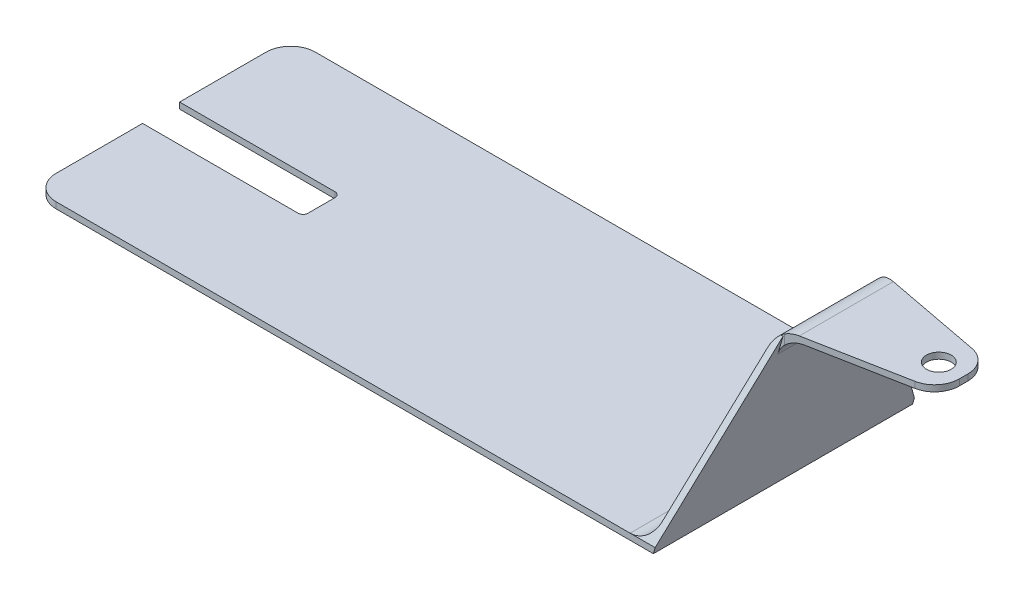
ISO-10303-21;
HEADER;
FILE_DESCRIPTION(('STEP AP214'),'2;1');
FILE_NAME('part.step','',(''),(''),'','','');
FILE_SCHEMA(('AUTOMOTIVE_DESIGN { 1 0 10303 214 1 1 1 1 }'));
ENDSEC;
DATA;
#1=APPLICATION_CONTEXT('core data for automotive mechanical design processes');
#2=APPLICATION_PROTOCOL_DEFINITION('international standard','automotive_design',2000,#1);
#3=PRODUCT_CONTEXT('',#1,'mechanical');
#4=PRODUCT('Part','Part','',(#3));
#5=PRODUCT_RELATED_PRODUCT_CATEGORY('part','',(#4));
#6=PRODUCT_DEFINITION_FORMATION('','',#4);
#7=PRODUCT_DEFINITION_CONTEXT('part definition',#1,'design');
#8=PRODUCT_DEFINITION('design','',#6,#7);
#9=PRODUCT_DEFINITION_SHAPE('','',#8);
#10=(LENGTH_UNIT() NAMED_UNIT(*) SI_UNIT(.MILLI.,.METRE.));
#11=(NAMED_UNIT(*) PLANE_ANGLE_UNIT() SI_UNIT($,.RADIAN.));
#12=(NAMED_UNIT(*) SI_UNIT($,.STERADIAN.) SOLID_ANGLE_UNIT());
#13=UNCERTAINTY_MEASURE_WITH_UNIT(LENGTH_MEASURE(1.E-05),#10,'distance_accuracy_value','');
#14=(GEOMETRIC_REPRESENTATION_CONTEXT(3) GLOBAL_UNCERTAINTY_ASSIGNED_CONTEXT((#13)) GLOBAL_UNIT_ASSIGNED_CONTEXT((#10,
#11,#12)) REPRESENTATION_CONTEXT('',''));
#15=CARTESIAN_POINT('',(0.,0.,0.));
#16=DIRECTION('',(0.,0.,1.));
#17=DIRECTION('',(1.,0.,0.));
#18=AXIS2_PLACEMENT_3D('',#15,#16,#17);
#19=CARTESIAN_POINT('',(200.,68.75,105.));
#20=DIRECTION('',(0.,-1.,0.));
#21=DIRECTION('',(1.,0.,0.));
#22=AXIS2_PLACEMENT_3D('',#19,#20,#21);
#23=PLANE('',#22);
#24=CARTESIAN_POINT('',(190.,68.75,52.5));
#25=DIRECTION('',(0.,-1.,0.));
#26=DIRECTION('',(1.,0.,0.));
#27=AXIS2_PLACEMENT_3D('',#24,#25,#26);
#28=CIRCLE('',#27,5.00000000000002);
#29=CARTESIAN_POINT('',(195.,68.75,52.5));
#30=VERTEX_POINT('',#29);
#31=EDGE_CURVE('E845',#30,#30,#28,.F.);
#32=ORIENTED_EDGE('',*,*,#31,.T.);
#33=EDGE_LOOP('',(#32));
#34=FACE_BOUND('',#33,.T.);
#35=DIRECTION('',(0.982338566422475,0.,-0.187112107889995));
#36=VECTOR('',#35,1.);
#37=CARTESIAN_POINT('',(18.4901531728665,68.75,97.0733041575492));
#38=LINE('',#37,#36);
#39=CARTESIAN_POINT('',(154.428767659429,68.75,71.1802347315372));
#40=VERTEX_POINT('',#39);
#41=CARTESIAN_POINT('',(191.8711210789,68.75,64.0483578897333));
#42=VERTEX_POINT('',#41);
#43=EDGE_CURVE('E823',#40,#42,#38,.T.);
#44=ORIENTED_EDGE('',*,*,#43,.F.);
#45=DIRECTION('',(0.,0.,-1.));
#46=VECTOR('',#45,1.);
#47=CARTESIAN_POINT('',(154.428767659429,68.75,32.5));
#48=LINE('',#47,#46);
#49=CARTESIAN_POINT('',(154.428767659429,68.75,33.8197652684628));
#50=VERTEX_POINT('',#49);
#51=EDGE_CURVE('E227',#40,#50,#48,.T.);
#52=ORIENTED_EDGE('',*,*,#51,.T.);
#53=DIRECTION('',(0.982338566422475,0.,0.187112107889995));
#54=VECTOR('',#53,1.);
#55=CARTESIAN_POINT('',(-0.809628008752751,68.7499999999999,4.25054704595185));
#56=LINE('',#55,#54);
#57=CARTESIAN_POINT('',(191.8711210789,68.75,40.9516421102667));
#58=VERTEX_POINT('',#57);
#59=EDGE_CURVE('E814',#50,#58,#56,.T.);
#60=ORIENTED_EDGE('',*,*,#59,.T.);
#61=CARTESIAN_POINT('',(190.,68.75,50.7750277744914));
#62=DIRECTION('',(0.,-1.,0.));
#63=DIRECTION('',(1.,0.,0.));
#64=AXIS2_PLACEMENT_3D('',#61,#62,#63);
#65=CIRCLE('',#64,10.);
#66=CARTESIAN_POINT('',(200.,68.75,50.7750277744914));
#67=VERTEX_POINT('',#66);
#68=EDGE_CURVE('E364',#58,#67,#65,.T.);
#69=ORIENTED_EDGE('',*,*,#68,.T.);
#70=DIRECTION('',(0.,0.,-1.));
#71=VECTOR('',#70,1.);
#72=CARTESIAN_POINT('',(200.,68.75,105.));
#73=LINE('',#72,#71);
#74=CARTESIAN_POINT('',(200.,68.75,54.2249722255086));
#75=VERTEX_POINT('',#74);
#76=EDGE_CURVE('E326',#75,#67,#73,.T.);
#77=ORIENTED_EDGE('',*,*,#76,.F.);
#78=CARTESIAN_POINT('',(190.,68.75,54.2249722255086));
#79=DIRECTION('',(0.,-1.,0.));
#80=DIRECTION('',(1.,0.,0.));
#81=AXIS2_PLACEMENT_3D('',#78,#79,#80);
#82=CIRCLE('',#81,10.);
#83=EDGE_CURVE('E360',#75,#42,#82,.T.);
#84=ORIENTED_EDGE('',*,*,#83,.T.);
#85=EDGE_LOOP('',(#44,#52,#60,#69,#77,#84));
#86=FACE_BOUND('',#85,.T.);
#87=ADVANCED_FACE('F39',(#34,#86),#23,.T.);
#88=CARTESIAN_POINT('',(200.,71.25,105.));
#89=DIRECTION('',(1.,0.,0.));
#90=DIRECTION('',(0.,0.,-1.));
#91=AXIS2_PLACEMENT_3D('',#88,#89,#90);
#92=PLANE('',#91);
#93=ORIENTED_EDGE('',*,*,#76,.T.);
#94=DIRECTION('',(0.,1.,0.));
#95=VECTOR('',#94,1.);
#96=CARTESIAN_POINT('',(200.,71.25,50.7750277744914));
#97=LINE('',#96,#95);
#98=CARTESIAN_POINT('',(200.,71.25,50.7750277744914));
#99=VERTEX_POINT('',#98);
#100=EDGE_CURVE('E345',#67,#99,#97,.T.);
#101=ORIENTED_EDGE('',*,*,#100,.T.);
#102=DIRECTION('',(0.,0.,-1.));
#103=VECTOR('',#102,1.);
#104=CARTESIAN_POINT('',(200.,71.25,105.));
#105=LINE('',#104,#103);
#106=CARTESIAN_POINT('',(200.,71.25,54.2249722255086));
#107=VERTEX_POINT('',#106);
#108=EDGE_CURVE('E330',#107,#99,#105,.T.);
#109=ORIENTED_EDGE('',*,*,#108,.F.);
#110=DIRECTION('',(0.,1.,0.));
#111=VECTOR('',#110,1.);
#112=CARTESIAN_POINT('',(200.,71.25,54.2249722255086));
#113=LINE('',#112,#111);
#114=EDGE_CURVE('E342',#107,#75,#113,.F.);
#115=ORIENTED_EDGE('',*,*,#114,.T.);
#116=EDGE_LOOP('',(#93,#101,#109,#115));
#117=FACE_BOUND('',#116,.T.);
#118=ADVANCED_FACE('F554',(#117),#92,.T.);
#119=CARTESIAN_POINT('',(145.,71.25,105.));
#120=DIRECTION('',(0.,1.,0.));
#121=DIRECTION('',(0.,0.,1.));
#122=AXIS2_PLACEMENT_3D('',#119,#120,#121);
#123=PLANE('',#122);
#124=CARTESIAN_POINT('',(190.,71.25,52.5));
#125=DIRECTION('',(0.,1.,0.));
#126=DIRECTION('',(0.,0.,1.));
#127=AXIS2_PLACEMENT_3D('',#124,#125,#126);
#128=CIRCLE('',#127,5.00000000000002);
#129=CARTESIAN_POINT('',(190.,71.25,57.5));
#130=VERTEX_POINT('',#129);
#131=EDGE_CURVE('E830',#130,#130,#128,.T.);
#132=ORIENTED_EDGE('',*,*,#131,.F.);
#133=EDGE_LOOP('',(#132));
#134=FACE_BOUND('',#133,.T.);
#135=DIRECTION('',(0.982338566422475,0.,0.187112107889995));
#136=VECTOR('',#135,1.);
#137=CARTESIAN_POINT('',(-0.809628008752734,71.25,4.25054704595185));
#138=LINE('',#137,#136);
#139=CARTESIAN_POINT('',(152.543014127544,71.25,33.4605741195321));
#140=VERTEX_POINT('',#139);
#141=CARTESIAN_POINT('',(191.8711210789,71.25,40.9516421102667));
#142=VERTEX_POINT('',#141);
#143=EDGE_CURVE('E815',#140,#142,#138,.T.);
#144=ORIENTED_EDGE('',*,*,#143,.F.);
#145=DIRECTION('',(0.,0.,-1.));
#146=VECTOR('',#145,1.);
#147=CARTESIAN_POINT('',(152.543014127544,71.25,105.));
#148=LINE('',#147,#146);
#149=CARTESIAN_POINT('',(152.543014127544,71.25,71.5394258804679));
#150=VERTEX_POINT('',#149);
#151=EDGE_CURVE('E384',#140,#150,#148,.F.);
#152=ORIENTED_EDGE('',*,*,#151,.T.);
#153=DIRECTION('',(0.982338566422475,0.,-0.187112107889995));
#154=VECTOR('',#153,1.);
#155=CARTESIAN_POINT('',(18.4901531728665,71.25,97.0733041575492));
#156=LINE('',#155,#154);
#157=CARTESIAN_POINT('',(191.8711210789,71.25,64.0483578897333));
#158=VERTEX_POINT('',#157);
#159=EDGE_CURVE('E255',#150,#158,#156,.T.);
#160=ORIENTED_EDGE('',*,*,#159,.T.);
#161=CARTESIAN_POINT('',(190.,71.25,54.2249722255086));
#162=DIRECTION('',(0.,1.,0.));
#163=DIRECTION('',(0.,0.,1.));
#164=AXIS2_PLACEMENT_3D('',#161,#162,#163);
#165=CIRCLE('',#164,10.);
#166=EDGE_CURVE('E349',#158,#107,#165,.T.);
#167=ORIENTED_EDGE('',*,*,#166,.T.);
#168=ORIENTED_EDGE('',*,*,#108,.T.);
#169=CARTESIAN_POINT('',(190.,71.25,50.7750277744914));
#170=DIRECTION('',(0.,1.,0.));
#171=DIRECTION('',(0.,0.,1.));
#172=AXIS2_PLACEMENT_3D('',#169,#170,#171);
#173=CIRCLE('',#172,10.);
#174=EDGE_CURVE('E352',#99,#142,#173,.T.);
#175=ORIENTED_EDGE('',*,*,#174,.T.);
#176=EDGE_LOOP('',(#144,#152,#160,#167,#168,#175));
#177=FACE_BOUND('',#176,.T.);
#178=ADVANCED_FACE('F560',(#134,#177),#123,.T.);
#179=CARTESIAN_POINT('',(200.,0.,72.5));
#180=DIRECTION('',(0.,0.,1.));
#181=DIRECTION('',(1.,0.,0.));
#182=AXIS2_PLACEMENT_3D('',#179,#180,#181);
#183=PLANE('',#182);
#184=DIRECTION('',(0.,1.,0.));
#185=VECTOR('',#184,1.);
#186=CARTESIAN_POINT('',(147.5,-1.251,72.5));
#187=LINE('',#186,#185);
#188=CARTESIAN_POINT('',(147.5,65.9605602224546,72.5));
#189=VERTEX_POINT('',#188);
#190=CARTESIAN_POINT('',(147.5,69.8852769793097,72.5));
#191=VERTEX_POINT('',#190);
#192=EDGE_CURVE('E248',#189,#191,#187,.T.);
#193=ORIENTED_EDGE('',*,*,#192,.T.);
#194=CARTESIAN_POINT('',(152.543014127544,61.25,72.5));
#195=DIRECTION('',(0.,0.,1.));
#196=DIRECTION('',(1.,0.,0.));
#197=AXIS2_PLACEMENT_3D('',#194,#195,#196);
#198=CIRCLE('',#197,10.);
#199=CARTESIAN_POINT('',(145.928635849882,68.75,72.5));
#200=VERTEX_POINT('',#199);
#201=EDGE_CURVE('E245',#191,#200,#198,.T.);
#202=ORIENTED_EDGE('',*,*,#201,.T.);
#203=DIRECTION('',(-1.,0.,0.));
#204=VECTOR('',#203,1.);
#205=CARTESIAN_POINT('',(200.,68.75,72.5));
#206=LINE('',#205,#204);
#207=CARTESIAN_POINT('',(146.885753531886,68.75,72.5));
#208=VERTEX_POINT('',#207);
#209=EDGE_CURVE('E233',#208,#200,#206,.T.);
#210=ORIENTED_EDGE('',*,*,#209,.F.);
#211=DIRECTION('',(0.274721127897378,0.961523947640823,0.));
#212=VECTOR('',#211,1.);
#213=CARTESIAN_POINT('',(132.733998548347,19.218857557615,72.5));
#214=LINE('',#213,#212);
#215=CARTESIAN_POINT('',(144.813528183021,61.4972112789738,72.5));
#216=VERTEX_POINT('',#215);
#217=EDGE_CURVE('E212',#216,#208,#214,.T.);
#218=ORIENTED_EDGE('',*,*,#217,.F.);
#219=CARTESIAN_POINT('',(154.428767659429,58.75,72.5));
#220=DIRECTION('',(0.,0.,1.));
#221=DIRECTION('',(1.,0.,0.));
#222=AXIS2_PLACEMENT_3D('',#219,#220,#221);
#223=CIRCLE('',#222,10.);
#224=EDGE_CURVE('E410',#216,#189,#223,.F.);
#225=ORIENTED_EDGE('',*,*,#224,.T.);
#226=EDGE_LOOP('',(#193,#202,#210,#218,#225));
#227=FACE_BOUND('',#226,.T.);
#228=ADVANCED_FACE('F243',(#227),#183,.T.);
#229=CARTESIAN_POINT('',(146.885753531886,68.75,105.));
#230=DIRECTION('',(0.961523947640823,-0.274721127897378,0.));
#231=DIRECTION('',(0.274721127897378,0.961523947640823,0.));
#232=AXIS2_PLACEMENT_3D('',#229,#230,#231);
#233=PLANE('',#232);
#234=DIRECTION('',(0.249300996444224,0.872553487554785,0.420118345859711));
#235=VECTOR('',#234,1.);
#236=CARTESIAN_POINT('',(154.479107894817,95.3267402702588,45.2962082782727));
#237=LINE('',#236,#235);
#238=CARTESIAN_POINT('',(127.600039246172,1.25000000000001,0.));
#239=VERTEX_POINT('',#238);
#240=CARTESIAN_POINT('',(146.885753531886,68.75,32.5));
#241=VERTEX_POINT('',#240);
#242=EDGE_CURVE('E262',#239,#241,#237,.T.);
#243=ORIENTED_EDGE('',*,*,#242,.T.);
#244=DIRECTION('',(-0.274721127897378,-0.961523947640823,0.));
#245=VECTOR('',#244,1.);
#246=CARTESIAN_POINT('',(146.885753531886,68.75,32.5));
#247=LINE('',#246,#245);
#248=CARTESIAN_POINT('',(144.813528183021,61.4972112789738,32.5));
#249=VERTEX_POINT('',#248);
#250=EDGE_CURVE('E400',#241,#249,#247,.T.);
#251=ORIENTED_EDGE('',*,*,#250,.T.);
#252=DIRECTION('',(0.,0.,-1.));
#253=VECTOR('',#252,1.);
#254=CARTESIAN_POINT('',(144.813528183021,61.4972112789738,72.5));
#255=LINE('',#254,#253);
#256=EDGE_CURVE('E221',#249,#216,#255,.F.);
#257=ORIENTED_EDGE('',*,*,#256,.T.);
#258=ORIENTED_EDGE('',*,*,#217,.T.);
#259=DIRECTION('',(-0.249300996444224,-0.872553487554785,0.420118345859711));
#260=VECTOR('',#259,1.);
#261=CARTESIAN_POINT('',(143.481836058848,56.8362888443668,78.2362312971568));
#262=LINE('',#261,#260);
#263=CARTESIAN_POINT('',(127.600039246172,1.25,105.));
#264=VERTEX_POINT('',#263);
#265=EDGE_CURVE('E217',#208,#264,#262,.T.);
#266=ORIENTED_EDGE('',*,*,#265,.T.);
#267=DIRECTION('',(-0.274721127897378,-0.961523947640823,0.));
#268=VECTOR('',#267,1.);
#269=CARTESIAN_POINT('',(146.885753531886,68.75,105.));
#270=LINE('',#269,#268);
#271=CARTESIAN_POINT('',(126.885753531886,-1.25,105.));
#272=VERTEX_POINT('',#271);
#273=EDGE_CURVE('E301',#264,#272,#270,.T.);
#274=ORIENTED_EDGE('',*,*,#273,.T.);
#275=DIRECTION('',(0.,0.,-1.));
#276=VECTOR('',#275,1.);
#277=CARTESIAN_POINT('',(126.885753531886,-1.25,105.));
#278=LINE('',#277,#276);
#279=CARTESIAN_POINT('',(126.885753531886,-1.25,0.));
#280=VERTEX_POINT('',#279);
#281=EDGE_CURVE('E322',#272,#280,#278,.T.);
#282=ORIENTED_EDGE('',*,*,#281,.T.);
#283=DIRECTION('',(-0.274721127897378,-0.961523947640823,0.));
#284=VECTOR('',#283,1.);
#285=CARTESIAN_POINT('',(146.885753531886,68.75,0.));
#286=LINE('',#285,#284);
#287=EDGE_CURVE('E311',#239,#280,#286,.T.);
#288=ORIENTED_EDGE('',*,*,#287,.F.);
#289=EDGE_LOOP('',(#243,#251,#257,#258,#266,#274,#282,#288));
#290=FACE_BOUND('',#289,.T.);
#291=ADVANCED_FACE('F215',(#290),#233,.T.);
#292=CARTESIAN_POINT('',(125.,1.25,105.));
#293=DIRECTION('',(-0.961523947640823,0.274721127897378,0.));
#294=DIRECTION('',(-0.274721127897378,-0.961523947640823,0.));
#295=AXIS2_PLACEMENT_3D('',#292,#293,#294);
#296=PLANE('',#295);
#297=DIRECTION('',(-0.249300996444224,-0.872553487554784,-0.420118345859711));
#298=VECTOR('',#297,1.);
#299=CARTESIAN_POINT('',(135.997271835969,39.740451425892,18.5324395754294));
#300=LINE('',#299,#298);
#301=CARTESIAN_POINT('',(142.927774651135,63.9972112789738,30.2116202454318));
#302=VERTEX_POINT('',#301);
#303=CARTESIAN_POINT('',(127.072225348865,8.50278872102623,3.49208345827186));
#304=VERTEX_POINT('',#303);
#305=EDGE_CURVE('E253',#302,#304,#300,.T.);
#306=ORIENTED_EDGE('',*,*,#305,.T.);
#307=DIRECTION('',(0.,0.,-1.));
#308=VECTOR('',#307,1.);
#309=CARTESIAN_POINT('',(127.072225348865,8.50278872102622,105.));
#310=LINE('',#309,#308);
#311=CARTESIAN_POINT('',(127.072225348865,8.50278872102622,101.507916541728));
#312=VERTEX_POINT('',#311);
#313=EDGE_CURVE('E420',#304,#312,#310,.F.);
#314=ORIENTED_EDGE('',*,*,#313,.T.);
#315=DIRECTION('',(0.249300996444224,0.872553487554784,-0.420118345859711));
#316=VECTOR('',#315,1.);
#317=CARTESIAN_POINT('',(125.,1.25,105.));
#318=LINE('',#317,#316);
#319=CARTESIAN_POINT('',(142.927774651135,63.9972112789738,74.7883797545682));
#320=VERTEX_POINT('',#319);
#321=EDGE_CURVE('E240',#312,#320,#318,.T.);
#322=ORIENTED_EDGE('',*,*,#321,.T.);
#323=DIRECTION('',(0.,0.,-1.));
#324=VECTOR('',#323,1.);
#325=CARTESIAN_POINT('',(142.927774651135,63.9972112789738,105.));
#326=LINE('',#325,#324);
#327=EDGE_CURVE('E371',#320,#302,#326,.T.);
#328=ORIENTED_EDGE('',*,*,#327,.T.);
#329=EDGE_LOOP('',(#306,#314,#322,#328));
#330=FACE_BOUND('',#329,.T.);
#331=ADVANCED_FACE('F533',(#330),#296,.T.);
#332=CARTESIAN_POINT('',(0.,0.,105.));
#333=DIRECTION('',(0.,0.,-1.));
#334=DIRECTION('',(-1.,0.,0.));
#335=AXIS2_PLACEMENT_3D('',#332,#333,#334);
#336=PLANE('',#335);
#337=DIRECTION('',(1.,0.,0.));
#338=VECTOR('',#337,1.);
#339=CARTESIAN_POINT('',(-125.,1.25,105.));
#340=LINE('',#339,#338);
#341=CARTESIAN_POINT('',(-115.,1.25,105.));
#342=VERTEX_POINT('',#341);
#343=CARTESIAN_POINT('',(117.456985872456,1.25,105.));
#344=VERTEX_POINT('',#343);
#345=EDGE_CURVE('E298',#342,#344,#340,.T.);
#346=ORIENTED_EDGE('',*,*,#345,.F.);
#347=DIRECTION('',(0.,1.,0.));
#348=VECTOR('',#347,1.);
#349=CARTESIAN_POINT('',(-115.,-1.25,105.));
#350=LINE('',#349,#348);
#351=CARTESIAN_POINT('',(-115.,-1.24999999999986,105.));
#352=VERTEX_POINT('',#351);
#353=EDGE_CURVE('E11',#342,#352,#350,.F.);
#354=ORIENTED_EDGE('',*,*,#353,.T.);
#355=DIRECTION('',(1.,0.,0.));
#356=VECTOR('',#355,1.);
#357=CARTESIAN_POINT('',(125.,-1.25,105.));
#358=LINE('',#357,#356);
#359=EDGE_CURVE('E305',#352,#272,#358,.T.);
#360=ORIENTED_EDGE('',*,*,#359,.T.);
#361=ORIENTED_EDGE('',*,*,#273,.F.);
#362=DIRECTION('',(1.,0.,0.));
#363=VECTOR('',#362,1.);
#364=CARTESIAN_POINT('',(0.,1.25,105.));
#365=LINE('',#364,#363);
#366=EDGE_CURVE('E237',#344,#264,#365,.T.);
#367=ORIENTED_EDGE('',*,*,#366,.F.);
#368=EDGE_LOOP('',(#346,#354,#360,#361,#367));
#369=FACE_BOUND('',#368,.T.);
#370=ADVANCED_FACE('F573',(#369),#336,.F.);
#371=CARTESIAN_POINT('',(0.,0.,0.));
#372=DIRECTION('',(0.,0.,-1.));
#373=DIRECTION('',(-1.,0.,0.));
#374=AXIS2_PLACEMENT_3D('',#371,#372,#373);
#375=PLANE('',#374);
#376=DIRECTION('',(1.,0.,0.));
#377=VECTOR('',#376,1.);
#378=CARTESIAN_POINT('',(-125.,-1.25,0.));
#379=LINE('',#378,#377);
#380=CARTESIAN_POINT('',(-115.,-1.25,0.));
#381=VERTEX_POINT('',#380);
#382=EDGE_CURVE('E302',#381,#280,#379,.T.);
#383=ORIENTED_EDGE('',*,*,#382,.F.);
#384=DIRECTION('',(0.,1.,0.));
#385=VECTOR('',#384,1.);
#386=CARTESIAN_POINT('',(-115.,0.,0.));
#387=LINE('',#386,#385);
#388=CARTESIAN_POINT('',(-115.,1.25,0.));
#389=VERTEX_POINT('',#388);
#390=EDGE_CURVE('E455',#381,#389,#387,.T.);
#391=ORIENTED_EDGE('',*,*,#390,.T.);
#392=DIRECTION('',(1.,0.,0.));
#393=VECTOR('',#392,1.);
#394=CARTESIAN_POINT('',(-125.,1.25,0.));
#395=LINE('',#394,#393);
#396=CARTESIAN_POINT('',(117.456985872456,1.25000000000001,0.));
#397=VERTEX_POINT('',#396);
#398=EDGE_CURVE('E297',#389,#397,#395,.T.);
#399=ORIENTED_EDGE('',*,*,#398,.T.);
#400=DIRECTION('',(1.,0.,0.));
#401=VECTOR('',#400,1.);
#402=CARTESIAN_POINT('',(0.,1.25000000000001,0.));
#403=LINE('',#402,#401);
#404=EDGE_CURVE('E320',#397,#239,#403,.T.);
#405=ORIENTED_EDGE('',*,*,#404,.T.);
#406=ORIENTED_EDGE('',*,*,#287,.T.);
#407=EDGE_LOOP('',(#383,#391,#399,#405,#406));
#408=FACE_BOUND('',#407,.T.);
#409=ADVANCED_FACE('F521',(#408),#375,.T.);
#410=CARTESIAN_POINT('',(-125.,-1.25,105.));
#411=DIRECTION('',(-1.,0.,0.));
#412=DIRECTION('',(0.,0.,1.));
#413=AXIS2_PLACEMENT_3D('',#410,#411,#412);
#414=PLANE('',#413);
#415=DIRECTION('',(0.,0.,-1.));
#416=VECTOR('',#415,1.);
#417=CARTESIAN_POINT('',(-125.,1.25,105.));
#418=LINE('',#417,#416);
#419=CARTESIAN_POINT('',(-125.,1.25,45.));
#420=VERTEX_POINT('',#419);
#421=CARTESIAN_POINT('',(-125.,1.25,9.99999999999999));
#422=VERTEX_POINT('',#421);
#423=EDGE_CURVE('E308',#420,#422,#418,.T.);
#424=ORIENTED_EDGE('',*,*,#423,.T.);
#425=DIRECTION('',(0.,1.,0.));
#426=VECTOR('',#425,1.);
#427=CARTESIAN_POINT('',(-125.,-1.25,9.99999999999999));
#428=LINE('',#427,#426);
#429=CARTESIAN_POINT('',(-125.,-1.25,9.99999999999999));
#430=VERTEX_POINT('',#429);
#431=EDGE_CURVE('E465',#422,#430,#428,.F.);
#432=ORIENTED_EDGE('',*,*,#431,.T.);
#433=DIRECTION('',(0.,0.,-1.));
#434=VECTOR('',#433,1.);
#435=CARTESIAN_POINT('',(-125.,-1.25,105.));
#436=LINE('',#435,#434);
#437=CARTESIAN_POINT('',(-125.,-1.25,45.));
#438=VERTEX_POINT('',#437);
#439=EDGE_CURVE('E321',#438,#430,#436,.T.);
#440=ORIENTED_EDGE('',*,*,#439,.F.);
#441=DIRECTION('',(0.,1.,0.));
#442=VECTOR('',#441,1.);
#443=CARTESIAN_POINT('',(-125.,-1.251,45.));
#444=LINE('',#443,#442);
#445=EDGE_CURVE('E286',#438,#420,#444,.T.);
#446=ORIENTED_EDGE('',*,*,#445,.T.);
#447=EDGE_LOOP('',(#424,#432,#440,#446));
#448=FACE_BOUND('',#447,.T.);
#449=ADVANCED_FACE('F511',(#448),#414,.T.);
#450=CARTESIAN_POINT('',(-125.,-1.25,95.));
#451=VERTEX_POINT('',#450);
#452=CARTESIAN_POINT('',(-125.,-1.25,60.));
#453=VERTEX_POINT('',#452);
#454=EDGE_CURVE('E317',#451,#453,#436,.T.);
#455=ORIENTED_EDGE('',*,*,#454,.F.);
#456=DIRECTION('',(0.,1.,0.));
#457=VECTOR('',#456,1.);
#458=CARTESIAN_POINT('',(-125.,1.25,95.));
#459=LINE('',#458,#457);
#460=CARTESIAN_POINT('',(-125.,1.25,95.));
#461=VERTEX_POINT('',#460);
#462=EDGE_CURVE('E48',#451,#461,#459,.T.);
#463=ORIENTED_EDGE('',*,*,#462,.T.);
#464=CARTESIAN_POINT('',(-125.,1.25,60.));
#465=VERTEX_POINT('',#464);
#466=EDGE_CURVE('E334',#461,#465,#418,.T.);
#467=ORIENTED_EDGE('',*,*,#466,.T.);
#468=DIRECTION('',(0.,1.,0.));
#469=VECTOR('',#468,1.);
#470=CARTESIAN_POINT('',(-125.,-1.251,60.));
#471=LINE('',#470,#469);
#472=EDGE_CURVE('E285',#453,#465,#471,.T.);
#473=ORIENTED_EDGE('',*,*,#472,.F.);
#474=EDGE_LOOP('',(#455,#463,#467,#473));
#475=FACE_BOUND('',#474,.T.);
#476=ADVANCED_FACE('F477',(#475),#414,.T.);
#477=CARTESIAN_POINT('',(-125.,-1.25,105.));
#478=DIRECTION('',(0.,1.,0.));
#479=DIRECTION('',(0.,0.,1.));
#480=AXIS2_PLACEMENT_3D('',#477,#478,#479);
#481=PLANE('',#480);
#482=ORIENTED_EDGE('',*,*,#439,.T.);
#483=CARTESIAN_POINT('',(-115.,-1.25,10.));
#484=DIRECTION('',(0.,1.,0.));
#485=DIRECTION('',(0.,0.,1.));
#486=AXIS2_PLACEMENT_3D('',#483,#484,#485);
#487=CIRCLE('',#486,10.);
#488=EDGE_CURVE('E470',#430,#381,#487,.F.);
#489=ORIENTED_EDGE('',*,*,#488,.T.);
#490=ORIENTED_EDGE('',*,*,#382,.T.);
#491=ORIENTED_EDGE('',*,*,#281,.F.);
#492=ORIENTED_EDGE('',*,*,#359,.F.);
#493=CARTESIAN_POINT('',(-115.,-1.25,95.));
#494=DIRECTION('',(0.,1.,0.));
#495=DIRECTION('',(0.,0.,1.));
#496=AXIS2_PLACEMENT_3D('',#493,#494,#495);
#497=CIRCLE('',#496,10.);
#498=EDGE_CURVE('E55',#352,#451,#497,.F.);
#499=ORIENTED_EDGE('',*,*,#498,.T.);
#500=ORIENTED_EDGE('',*,*,#454,.T.);
#501=DIRECTION('',(-1.,0.,0.));
#502=VECTOR('',#501,1.);
#503=CARTESIAN_POINT('',(-125.,-1.25,60.));
#504=LINE('',#503,#502);
#505=CARTESIAN_POINT('',(-62.,-1.25,60.));
#506=VERTEX_POINT('',#505);
#507=EDGE_CURVE('E290',#506,#453,#504,.T.);
#508=ORIENTED_EDGE('',*,*,#507,.F.);
#509=CARTESIAN_POINT('',(-62.,-1.25,58.));
#510=DIRECTION('',(0.,1.,0.));
#511=DIRECTION('',(0.,0.,1.));
#512=AXIS2_PLACEMENT_3D('',#509,#510,#511);
#513=CIRCLE('',#512,2.);
#514=CARTESIAN_POINT('',(-60.,-1.25,58.));
#515=VERTEX_POINT('',#514);
#516=EDGE_CURVE('E452',#506,#515,#513,.T.);
#517=ORIENTED_EDGE('',*,*,#516,.T.);
#518=DIRECTION('',(0.,0.,1.));
#519=VECTOR('',#518,1.);
#520=CARTESIAN_POINT('',(-60.,-1.25,45.));
#521=LINE('',#520,#519);
#522=CARTESIAN_POINT('',(-60.,-1.25,47.));
#523=VERTEX_POINT('',#522);
#524=EDGE_CURVE('E239',#523,#515,#521,.T.);
#525=ORIENTED_EDGE('',*,*,#524,.F.);
#526=CARTESIAN_POINT('',(-62.,-1.25,47.));
#527=DIRECTION('',(0.,1.,0.));
#528=DIRECTION('',(0.,0.,1.));
#529=AXIS2_PLACEMENT_3D('',#526,#527,#528);
#530=CIRCLE('',#529,2.);
#531=CARTESIAN_POINT('',(-62.,-1.25,45.));
#532=VERTEX_POINT('',#531);
#533=EDGE_CURVE('E446',#523,#532,#530,.T.);
#534=ORIENTED_EDGE('',*,*,#533,.T.);
#535=DIRECTION('',(1.,0.,0.));
#536=VECTOR('',#535,1.);
#537=CARTESIAN_POINT('',(-125.,-1.25,45.));
#538=LINE('',#537,#536);
#539=EDGE_CURVE('E270',#438,#532,#538,.T.);
#540=ORIENTED_EDGE('',*,*,#539,.F.);
#541=EDGE_LOOP('',(#482,#489,#490,#491,#492,#499,#500,#508,#517,#525,#534,#540));
#542=FACE_BOUND('',#541,.T.);
#543=ADVANCED_FACE('F495',(#542),#481,.F.);
#544=CARTESIAN_POINT('',(-125.,1.25,105.));
#545=DIRECTION('',(0.,1.,0.));
#546=DIRECTION('',(0.,0.,1.));
#547=AXIS2_PLACEMENT_3D('',#544,#545,#546);
#548=PLANE('',#547);
#549=ORIENTED_EDGE('',*,*,#398,.F.);
#550=CARTESIAN_POINT('',(-115.,1.25,10.));
#551=DIRECTION('',(0.,1.,0.));
#552=DIRECTION('',(0.,0.,1.));
#553=AXIS2_PLACEMENT_3D('',#550,#551,#552);
#554=CIRCLE('',#553,10.);
#555=EDGE_CURVE('E462',#389,#422,#554,.T.);
#556=ORIENTED_EDGE('',*,*,#555,.T.);
#557=ORIENTED_EDGE('',*,*,#423,.F.);
#558=DIRECTION('',(-1.,0.,0.));
#559=VECTOR('',#558,1.);
#560=CARTESIAN_POINT('',(-125.,1.25,45.));
#561=LINE('',#560,#559);
#562=CARTESIAN_POINT('',(-62.,1.25,45.));
#563=VERTEX_POINT('',#562);
#564=EDGE_CURVE('E282',#563,#420,#561,.T.);
#565=ORIENTED_EDGE('',*,*,#564,.F.);
#566=CARTESIAN_POINT('',(-62.,1.25,47.));
#567=DIRECTION('',(0.,1.,0.));
#568=DIRECTION('',(0.,0.,1.));
#569=AXIS2_PLACEMENT_3D('',#566,#567,#568);
#570=CIRCLE('',#569,2.);
#571=CARTESIAN_POINT('',(-60.,1.25,47.));
#572=VERTEX_POINT('',#571);
#573=EDGE_CURVE('E443',#563,#572,#570,.F.);
#574=ORIENTED_EDGE('',*,*,#573,.T.);
#575=DIRECTION('',(0.,0.,-1.));
#576=VECTOR('',#575,1.);
#577=CARTESIAN_POINT('',(-60.,1.25,45.));
#578=LINE('',#577,#576);
#579=CARTESIAN_POINT('',(-60.,1.25,58.));
#580=VERTEX_POINT('',#579);
#581=EDGE_CURVE('E278',#580,#572,#578,.T.);
#582=ORIENTED_EDGE('',*,*,#581,.F.);
#583=CARTESIAN_POINT('',(-62.,1.25,58.));
#584=DIRECTION('',(0.,1.,0.));
#585=DIRECTION('',(0.,0.,1.));
#586=AXIS2_PLACEMENT_3D('',#583,#584,#585);
#587=CIRCLE('',#586,2.);
#588=CARTESIAN_POINT('',(-62.,1.25,60.));
#589=VERTEX_POINT('',#588);
#590=EDGE_CURVE('E449',#580,#589,#587,.F.);
#591=ORIENTED_EDGE('',*,*,#590,.T.);
#592=DIRECTION('',(1.,0.,0.));
#593=VECTOR('',#592,1.);
#594=CARTESIAN_POINT('',(-125.,1.25,60.));
#595=LINE('',#594,#593);
#596=EDGE_CURVE('E274',#465,#589,#595,.T.);
#597=ORIENTED_EDGE('',*,*,#596,.F.);
#598=ORIENTED_EDGE('',*,*,#466,.F.);
#599=CARTESIAN_POINT('',(-115.,1.25,95.));
#600=DIRECTION('',(0.,1.,0.));
#601=DIRECTION('',(0.,0.,1.));
#602=AXIS2_PLACEMENT_3D('',#599,#600,#601);
#603=CIRCLE('',#602,10.);
#604=EDGE_CURVE('E459',#461,#342,#603,.T.);
#605=ORIENTED_EDGE('',*,*,#604,.T.);
#606=ORIENTED_EDGE('',*,*,#345,.T.);
#607=DIRECTION('',(0.,0.,-1.));
#608=VECTOR('',#607,1.);
#609=CARTESIAN_POINT('',(117.456985872456,1.25,0.));
#610=LINE('',#609,#608);
#611=EDGE_CURVE('E416',#344,#397,#610,.T.);
#612=ORIENTED_EDGE('',*,*,#611,.T.);
#613=EDGE_LOOP('',(#549,#556,#557,#565,#574,#582,#591,#597,#598,#605,#606,#612));
#614=FACE_BOUND('',#613,.T.);
#615=ADVANCED_FACE('F483',(#614),#548,.T.);
#616=CARTESIAN_POINT('',(-125.,-1.251,45.));
#617=DIRECTION('',(0.,0.,-1.));
#618=DIRECTION('',(-1.,0.,0.));
#619=AXIS2_PLACEMENT_3D('',#616,#617,#618);
#620=PLANE('',#619);
#621=ORIENTED_EDGE('',*,*,#539,.T.);
#622=DIRECTION('',(0.,1.,0.));
#623=VECTOR('',#622,1.);
#624=CARTESIAN_POINT('',(-62.,1.25,45.));
#625=LINE('',#624,#623);
#626=EDGE_CURVE('E429',#532,#563,#625,.T.);
#627=ORIENTED_EDGE('',*,*,#626,.T.);
#628=ORIENTED_EDGE('',*,*,#564,.T.);
#629=ORIENTED_EDGE('',*,*,#445,.F.);
#630=EDGE_LOOP('',(#621,#627,#628,#629));
#631=FACE_BOUND('',#630,.T.);
#632=ADVANCED_FACE('F506',(#631),#620,.F.);
#633=CARTESIAN_POINT('',(-60.,-1.251,45.));
#634=DIRECTION('',(1.,0.,0.));
#635=DIRECTION('',(0.,0.,-1.));
#636=AXIS2_PLACEMENT_3D('',#633,#634,#635);
#637=PLANE('',#636);
#638=ORIENTED_EDGE('',*,*,#581,.T.);
#639=DIRECTION('',(0.,1.,0.));
#640=VECTOR('',#639,1.);
#641=CARTESIAN_POINT('',(-60.,-1.25,47.));
#642=LINE('',#641,#640);
#643=EDGE_CURVE('E437',#572,#523,#642,.F.);
#644=ORIENTED_EDGE('',*,*,#643,.T.);
#645=ORIENTED_EDGE('',*,*,#524,.T.);
#646=DIRECTION('',(0.,1.,0.));
#647=VECTOR('',#646,1.);
#648=CARTESIAN_POINT('',(-60.,1.25,58.));
#649=LINE('',#648,#647);
#650=EDGE_CURVE('E433',#515,#580,#649,.T.);
#651=ORIENTED_EDGE('',*,*,#650,.T.);
#652=EDGE_LOOP('',(#638,#644,#645,#651));
#653=FACE_BOUND('',#652,.T.);
#654=ADVANCED_FACE('F498',(#653),#637,.F.);
#655=CARTESIAN_POINT('',(-125.,-1.251,60.));
#656=DIRECTION('',(0.,0.,1.));
#657=DIRECTION('',(1.,0.,0.));
#658=AXIS2_PLACEMENT_3D('',#655,#656,#657);
#659=PLANE('',#658);
#660=ORIENTED_EDGE('',*,*,#596,.T.);
#661=DIRECTION('',(0.,1.,0.));
#662=VECTOR('',#661,1.);
#663=CARTESIAN_POINT('',(-62.,-1.25,60.));
#664=LINE('',#663,#662);
#665=EDGE_CURVE('E440',#589,#506,#664,.F.);
#666=ORIENTED_EDGE('',*,*,#665,.T.);
#667=ORIENTED_EDGE('',*,*,#507,.T.);
#668=ORIENTED_EDGE('',*,*,#472,.T.);
#669=EDGE_LOOP('',(#660,#666,#667,#668));
#670=FACE_BOUND('',#669,.T.);
#671=ADVANCED_FACE('F487',(#670),#659,.F.);
#672=CARTESIAN_POINT('',(200.,0.,32.5));
#673=DIRECTION('',(0.,0.,1.));
#674=DIRECTION('',(1.,0.,0.));
#675=AXIS2_PLACEMENT_3D('',#672,#673,#674);
#676=PLANE('',#675);
#677=DIRECTION('',(-1.,0.,0.));
#678=VECTOR('',#677,1.);
#679=CARTESIAN_POINT('',(200.,68.75,32.5));
#680=LINE('',#679,#678);
#681=CARTESIAN_POINT('',(145.928635849882,68.75,32.5));
#682=VERTEX_POINT('',#681);
#683=EDGE_CURVE('E247',#241,#682,#680,.T.);
#684=ORIENTED_EDGE('',*,*,#683,.T.);
#685=CARTESIAN_POINT('',(152.543014127544,61.25,32.5));
#686=DIRECTION('',(0.,0.,1.));
#687=DIRECTION('',(1.,0.,0.));
#688=AXIS2_PLACEMENT_3D('',#685,#686,#687);
#689=CIRCLE('',#688,10.);
#690=CARTESIAN_POINT('',(147.5,69.8852769793097,32.5));
#691=VERTEX_POINT('',#690);
#692=EDGE_CURVE('E378',#682,#691,#689,.F.);
#693=ORIENTED_EDGE('',*,*,#692,.T.);
#694=DIRECTION('',(0.,1.,0.));
#695=VECTOR('',#694,1.);
#696=CARTESIAN_POINT('',(147.5,-1.251,32.5));
#697=LINE('',#696,#695);
#698=CARTESIAN_POINT('',(147.5,65.9605602224546,32.5));
#699=VERTEX_POINT('',#698);
#700=EDGE_CURVE('E810',#699,#691,#697,.T.);
#701=ORIENTED_EDGE('',*,*,#700,.F.);
#702=CARTESIAN_POINT('',(154.428767659429,58.75,32.5));
#703=DIRECTION('',(0.,0.,1.));
#704=DIRECTION('',(1.,0.,0.));
#705=AXIS2_PLACEMENT_3D('',#702,#703,#704);
#706=CIRCLE('',#705,10.);
#707=EDGE_CURVE('E407',#699,#249,#706,.T.);
#708=ORIENTED_EDGE('',*,*,#707,.T.);
#709=ORIENTED_EDGE('',*,*,#250,.F.);
#710=EDGE_LOOP('',(#684,#693,#701,#708,#709));
#711=FACE_BOUND('',#710,.T.);
#712=ADVANCED_FACE('F543',(#711),#676,.F.);
#713=CARTESIAN_POINT('',(200.,0.235244988864144,-0.488585746102454));
#714=DIRECTION('',(0.,0.4338156187729,-0.9010016697591));
#715=DIRECTION('',(0.,0.9010016697591,0.4338156187729));
#716=AXIS2_PLACEMENT_3D('',#713,#714,#715);
#717=PLANE('',#716);
#718=ORIENTED_EDGE('',*,*,#305,.F.);
#719=CARTESIAN_POINT('',(152.543014127544,61.25,28.8888888888889));
#720=DIRECTION('',(0.,0.4338156187729,-0.9010016697591));
#721=DIRECTION('',(0.,-0.9010016697591,-0.4338156187729));
#722=AXIS2_PLACEMENT_3D('',#719,#720,#721);
#723=ELLIPSE('',#722,11.0987585657568,10.);
#724=EDGE_CURVE('E375',#302,#682,#723,.T.);
#725=ORIENTED_EDGE('',*,*,#724,.T.);
#726=ORIENTED_EDGE('',*,*,#683,.F.);
#727=ORIENTED_EDGE('',*,*,#242,.F.);
#728=ORIENTED_EDGE('',*,*,#404,.F.);
#729=CARTESIAN_POINT('',(117.456985872456,11.25,4.8148148148148));
#730=DIRECTION('',(0.,0.4338156187729,-0.9010016697591));
#731=DIRECTION('',(0.,0.9010016697591,0.4338156187729));
#732=AXIS2_PLACEMENT_3D('',#729,#730,#731);
#733=ELLIPSE('',#732,11.0987585657568,10.);
#734=EDGE_CURVE('E423',#397,#304,#733,.F.);
#735=ORIENTED_EDGE('',*,*,#734,.T.);
#736=EDGE_LOOP('',(#718,#725,#726,#727,#728,#735));
#737=FACE_BOUND('',#736,.T.);
#738=ADVANCED_FACE('F531',(#737),#717,.T.);
#739=CARTESIAN_POINT('',(200.,41.2764476614699,85.7280066815145));
#740=DIRECTION('',(0.,0.4338156187729,0.9010016697591));
#741=DIRECTION('',(0.,-0.9010016697591,0.4338156187729));
#742=AXIS2_PLACEMENT_3D('',#739,#740,#741);
#743=PLANE('',#742);
#744=ORIENTED_EDGE('',*,*,#209,.T.);
#745=CARTESIAN_POINT('',(152.543014127544,61.25,76.1111111111111));
#746=DIRECTION('',(0.,0.4338156187729,0.9010016697591));
#747=DIRECTION('',(0.,0.9010016697591,-0.4338156187729));
#748=AXIS2_PLACEMENT_3D('',#745,#746,#747);
#749=ELLIPSE('',#748,11.0987585657568,10.);
#750=EDGE_CURVE('E392',#200,#320,#749,.T.);
#751=ORIENTED_EDGE('',*,*,#750,.T.);
#752=ORIENTED_EDGE('',*,*,#321,.F.);
#753=CARTESIAN_POINT('',(117.456985872456,11.25,100.185185185185));
#754=DIRECTION('',(0.,0.4338156187729,0.9010016697591));
#755=DIRECTION('',(0.,-0.9010016697591,0.4338156187729));
#756=AXIS2_PLACEMENT_3D('',#753,#754,#755);
#757=ELLIPSE('',#756,11.0987585657568,10.);
#758=EDGE_CURVE('E426',#312,#344,#757,.F.);
#759=ORIENTED_EDGE('',*,*,#758,.T.);
#760=ORIENTED_EDGE('',*,*,#366,.T.);
#761=ORIENTED_EDGE('',*,*,#265,.F.);
#762=EDGE_LOOP('',(#744,#751,#752,#759,#760,#761));
#763=FACE_BOUND('',#762,.T.);
#764=ADVANCED_FACE('F231',(#763),#743,.T.);
#765=CARTESIAN_POINT('',(18.4901531728665,-1.251,97.0733041575492));
#766=DIRECTION('',(0.187112107889995,0.,0.982338566422475));
#767=DIRECTION('',(0.982338566422475,0.,-0.187112107889995));
#768=AXIS2_PLACEMENT_3D('',#765,#766,#767);
#769=PLANE('',#768);
#770=ORIENTED_EDGE('',*,*,#159,.F.);
#771=CARTESIAN_POINT('',(152.543014127544,61.25,71.5394258804679));
#772=DIRECTION('',(0.187112107889995,0.,0.982338566422475));
#773=DIRECTION('',(0.982338566422475,0.,-0.187112107889995));
#774=AXIS2_PLACEMENT_3D('',#771,#772,#773);
#775=ELLIPSE('',#774,10.1797896792533,10.);
#776=EDGE_CURVE('E387',#150,#191,#775,.T.);
#777=ORIENTED_EDGE('',*,*,#776,.T.);
#778=ORIENTED_EDGE('',*,*,#192,.F.);
#779=CARTESIAN_POINT('',(154.428767659429,58.75,71.1802347315372));
#780=DIRECTION('',(0.187112107889995,0.,0.982338566422475));
#781=DIRECTION('',(-0.982338566422475,0.,0.187112107889995));
#782=AXIS2_PLACEMENT_3D('',#779,#780,#781);
#783=ELLIPSE('',#782,10.1797896792533,10.);
#784=EDGE_CURVE('E413',#189,#40,#783,.F.);
#785=ORIENTED_EDGE('',*,*,#784,.T.);
#786=ORIENTED_EDGE('',*,*,#43,.T.);
#787=DIRECTION('',(0.,1.,0.));
#788=VECTOR('',#787,1.);
#789=CARTESIAN_POINT('',(191.8711210789,-1.251,64.0483578897333));
#790=LINE('',#789,#788);
#791=EDGE_CURVE('E367',#42,#158,#790,.T.);
#792=ORIENTED_EDGE('',*,*,#791,.T.);
#793=EDGE_LOOP('',(#770,#777,#778,#785,#786,#792));
#794=FACE_BOUND('',#793,.T.);
#795=ADVANCED_FACE('F608',(#794),#769,.T.);
#796=CARTESIAN_POINT('',(-0.809628008752734,-1.251,4.25054704595185));
#797=DIRECTION('',(-0.187112107889995,0.,0.982338566422475));
#798=DIRECTION('',(0.982338566422475,0.,0.187112107889995));
#799=AXIS2_PLACEMENT_3D('',#796,#797,#798);
#800=PLANE('',#799);
#801=ORIENTED_EDGE('',*,*,#700,.T.);
#802=CARTESIAN_POINT('',(152.543014127544,61.25,33.4605741195321));
#803=DIRECTION('',(-0.187112107889995,0.,0.982338566422475));
#804=DIRECTION('',(-0.982338566422475,0.,-0.187112107889995));
#805=AXIS2_PLACEMENT_3D('',#802,#803,#804);
#806=ELLIPSE('',#805,10.1797896792533,10.);
#807=EDGE_CURVE('E381',#691,#140,#806,.F.);
#808=ORIENTED_EDGE('',*,*,#807,.T.);
#809=ORIENTED_EDGE('',*,*,#143,.T.);
#810=DIRECTION('',(0.,1.,0.));
#811=VECTOR('',#810,1.);
#812=CARTESIAN_POINT('',(191.8711210789,68.75,40.9516421102667));
#813=LINE('',#812,#811);
#814=EDGE_CURVE('E356',#142,#58,#813,.F.);
#815=ORIENTED_EDGE('',*,*,#814,.T.);
#816=ORIENTED_EDGE('',*,*,#59,.F.);
#817=CARTESIAN_POINT('',(154.428767659429,58.75,33.8197652684628));
#818=DIRECTION('',(-0.187112107889995,0.,0.982338566422475));
#819=DIRECTION('',(0.982338566422475,0.,0.187112107889995));
#820=AXIS2_PLACEMENT_3D('',#817,#818,#819);
#821=ELLIPSE('',#820,10.1797896792533,10.);
#822=EDGE_CURVE('E403',#50,#699,#821,.T.);
#823=ORIENTED_EDGE('',*,*,#822,.T.);
#824=EDGE_LOOP('',(#801,#808,#809,#815,#816,#823));
#825=FACE_BOUND('',#824,.T.);
#826=ADVANCED_FACE('F582',(#825),#800,.F.);
#827=CARTESIAN_POINT('',(190.,71.25,50.7750277744914));
#828=DIRECTION('',(0.,-1.,0.));
#829=DIRECTION('',(0.,0.,-1.));
#830=AXIS2_PLACEMENT_3D('',#827,#828,#829);
#831=CYLINDRICAL_SURFACE('',#830,10.);
#832=ORIENTED_EDGE('',*,*,#68,.F.);
#833=ORIENTED_EDGE('',*,*,#814,.F.);
#834=ORIENTED_EDGE('',*,*,#174,.F.);
#835=ORIENTED_EDGE('',*,*,#100,.F.);
#836=EDGE_LOOP('',(#832,#833,#834,#835));
#837=FACE_BOUND('',#836,.T.);
#838=ADVANCED_FACE('F578',(#837),#831,.T.);
#839=CARTESIAN_POINT('',(190.,-1.251,54.2249722255086));
#840=DIRECTION('',(0.,1.,0.));
#841=DIRECTION('',(0.,0.,1.));
#842=AXIS2_PLACEMENT_3D('',#839,#840,#841);
#843=CYLINDRICAL_SURFACE('',#842,10.);
#844=ORIENTED_EDGE('',*,*,#83,.F.);
#845=ORIENTED_EDGE('',*,*,#114,.F.);
#846=ORIENTED_EDGE('',*,*,#166,.F.);
#847=ORIENTED_EDGE('',*,*,#791,.F.);
#848=EDGE_LOOP('',(#844,#845,#846,#847));
#849=FACE_BOUND('',#848,.T.);
#850=ADVANCED_FACE('F581',(#849),#843,.T.);
#851=CARTESIAN_POINT('',(152.543014127544,61.25,105.));
#852=DIRECTION('',(0.,0.,-1.));
#853=DIRECTION('',(-1.,0.,0.));
#854=AXIS2_PLACEMENT_3D('',#851,#852,#853);
#855=CYLINDRICAL_SURFACE('',#854,10.);
#856=ORIENTED_EDGE('',*,*,#776,.F.);
#857=ORIENTED_EDGE('',*,*,#151,.F.);
#858=ORIENTED_EDGE('',*,*,#807,.F.);
#859=ORIENTED_EDGE('',*,*,#692,.F.);
#860=ORIENTED_EDGE('',*,*,#724,.F.);
#861=ORIENTED_EDGE('',*,*,#327,.F.);
#862=ORIENTED_EDGE('',*,*,#750,.F.);
#863=ORIENTED_EDGE('',*,*,#201,.F.);
#864=EDGE_LOOP('',(#856,#857,#858,#859,#860,#861,#862,#863));
#865=FACE_BOUND('',#864,.T.);
#866=ADVANCED_FACE('F538',(#865),#855,.T.);
#867=CARTESIAN_POINT('',(154.428767659429,58.75,105.));
#868=DIRECTION('',(0.,0.,1.));
#869=DIRECTION('',(1.,0.,0.));
#870=AXIS2_PLACEMENT_3D('',#867,#868,#869);
#871=CYLINDRICAL_SURFACE('',#870,10.);
#872=ORIENTED_EDGE('',*,*,#224,.F.);
#873=ORIENTED_EDGE('',*,*,#256,.F.);
#874=ORIENTED_EDGE('',*,*,#707,.F.);
#875=ORIENTED_EDGE('',*,*,#822,.F.);
#876=ORIENTED_EDGE('',*,*,#51,.F.);
#877=ORIENTED_EDGE('',*,*,#784,.F.);
#878=EDGE_LOOP('',(#872,#873,#874,#875,#876,#877));
#879=FACE_BOUND('',#878,.T.);
#880=ADVANCED_FACE('F589',(#879),#871,.F.);
#881=CARTESIAN_POINT('',(117.456985872456,11.25,105.));
#882=DIRECTION('',(0.,0.,1.));
#883=DIRECTION('',(1.,0.,0.));
#884=AXIS2_PLACEMENT_3D('',#881,#882,#883);
#885=CYLINDRICAL_SURFACE('',#884,10.);
#886=ORIENTED_EDGE('',*,*,#758,.F.);
#887=ORIENTED_EDGE('',*,*,#313,.F.);
#888=ORIENTED_EDGE('',*,*,#734,.F.);
#889=ORIENTED_EDGE('',*,*,#611,.F.);
#890=EDGE_LOOP('',(#886,#887,#888,#889));
#891=FACE_BOUND('',#890,.T.);
#892=ADVANCED_FACE('F527',(#891),#885,.F.);
#893=CARTESIAN_POINT('',(-62.,-1.251,47.));
#894=DIRECTION('',(0.,-1.,0.));
#895=DIRECTION('',(0.,0.,-1.));
#896=AXIS2_PLACEMENT_3D('',#893,#894,#895);
#897=CYLINDRICAL_SURFACE('',#896,2.);
#898=ORIENTED_EDGE('',*,*,#533,.F.);
#899=ORIENTED_EDGE('',*,*,#643,.F.);
#900=ORIENTED_EDGE('',*,*,#573,.F.);
#901=ORIENTED_EDGE('',*,*,#626,.F.);
#902=EDGE_LOOP('',(#898,#899,#900,#901));
#903=FACE_BOUND('',#902,.T.);
#904=ADVANCED_FACE('F501',(#903),#897,.F.);
#905=CARTESIAN_POINT('',(-62.,-1.251,58.));
#906=DIRECTION('',(0.,-1.,0.));
#907=DIRECTION('',(0.,0.,-1.));
#908=AXIS2_PLACEMENT_3D('',#905,#906,#907);
#909=CYLINDRICAL_SURFACE('',#908,2.);
#910=ORIENTED_EDGE('',*,*,#516,.F.);
#911=ORIENTED_EDGE('',*,*,#665,.F.);
#912=ORIENTED_EDGE('',*,*,#590,.F.);
#913=ORIENTED_EDGE('',*,*,#650,.F.);
#914=EDGE_LOOP('',(#910,#911,#912,#913));
#915=FACE_BOUND('',#914,.T.);
#916=ADVANCED_FACE('F491',(#915),#909,.F.);
#917=CARTESIAN_POINT('',(190.,-1.251,52.5));
#918=DIRECTION('',(0.,1.,0.));
#919=DIRECTION('',(0.,0.,1.));
#920=AXIS2_PLACEMENT_3D('',#917,#918,#919);
#921=CYLINDRICAL_SURFACE('',#920,5.00000000000002);
#922=ORIENTED_EDGE('',*,*,#31,.F.);
#923=EDGE_LOOP('',(#922));
#924=FACE_BOUND('',#923,.T.);
#925=ORIENTED_EDGE('',*,*,#131,.T.);
#926=EDGE_LOOP('',(#925));
#927=FACE_BOUND('',#926,.T.);
#928=ADVANCED_FACE('F552',(#924,#927),#921,.F.);
#929=CARTESIAN_POINT('',(-115.,0.,10.));
#930=DIRECTION('',(0.,1.,0.));
#931=DIRECTION('',(0.,0.,1.));
#932=AXIS2_PLACEMENT_3D('',#929,#930,#931);
#933=CYLINDRICAL_SURFACE('',#932,10.);
#934=ORIENTED_EDGE('',*,*,#488,.F.);
#935=ORIENTED_EDGE('',*,*,#431,.F.);
#936=ORIENTED_EDGE('',*,*,#555,.F.);
#937=ORIENTED_EDGE('',*,*,#390,.F.);
#938=EDGE_LOOP('',(#934,#935,#936,#937));
#939=FACE_BOUND('',#938,.T.);
#940=ADVANCED_FACE('F519',(#939),#933,.T.);
#941=CARTESIAN_POINT('',(-115.,-1.25,95.));
#942=DIRECTION('',(0.,-1.,0.));
#943=DIRECTION('',(0.,0.,-1.));
#944=AXIS2_PLACEMENT_3D('',#941,#942,#943);
#945=CYLINDRICAL_SURFACE('',#944,10.);
#946=ORIENTED_EDGE('',*,*,#498,.F.);
#947=ORIENTED_EDGE('',*,*,#353,.F.);
#948=ORIENTED_EDGE('',*,*,#604,.F.);
#949=ORIENTED_EDGE('',*,*,#462,.F.);
#950=EDGE_LOOP('',(#946,#947,#948,#949));
#951=FACE_BOUND('',#950,.T.);
#952=ADVANCED_FACE('F41',(#951),#945,.T.);
#953=CLOSED_SHELL('',(#87,#118,#178,#228,#291,#331,#370,#409,#449,#476,#543,#615,#632,#654,#671,
#712,#738,#764,#795,#826,#838,#850,#866,#880,#892,#904,#916,#928,#940,#952));
#954=MANIFOLD_SOLID_BREP('B2',#953);
#955=ADVANCED_BREP_SHAPE_REPRESENTATION('',(#18,#954),#14);
#956=SHAPE_DEFINITION_REPRESENTATION(#9,#955);
ENDSEC;
END-ISO-10303-21;
